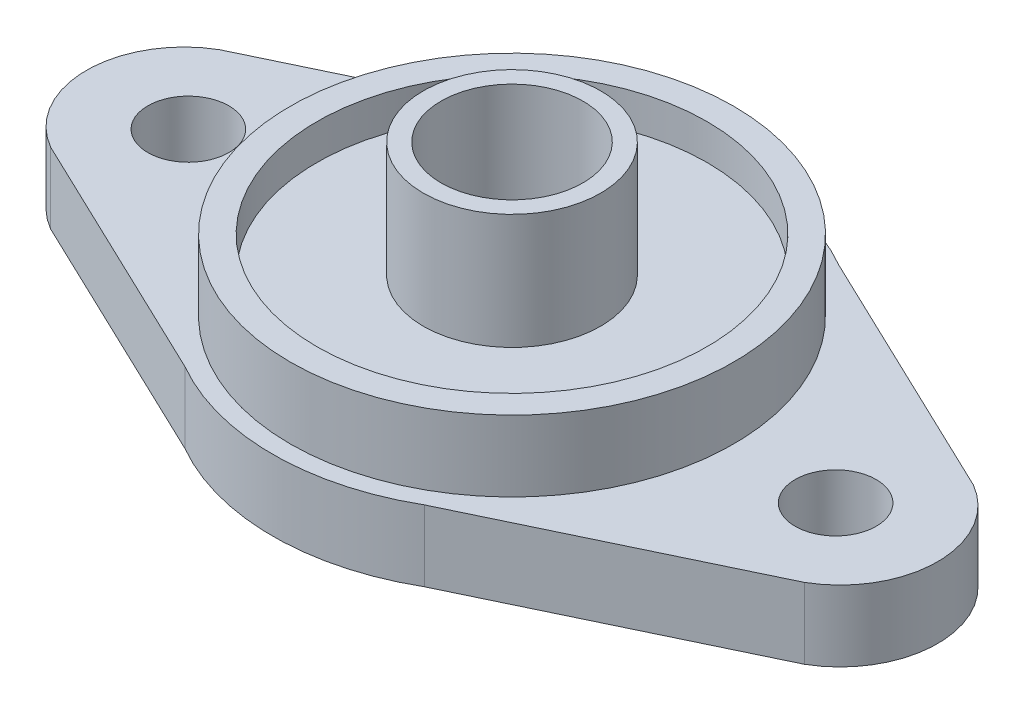
ISO-10303-21;
HEADER;
FILE_DESCRIPTION(('STEP AP214'),'2;1');
FILE_NAME('part.step','',(''),(''),'','','');
FILE_SCHEMA(('AUTOMOTIVE_DESIGN { 1 0 10303 214 1 1 1 1 }'));
ENDSEC;
DATA;
#1=APPLICATION_CONTEXT('core data for automotive mechanical design processes');
#2=APPLICATION_PROTOCOL_DEFINITION('international standard','automotive_design',2000,#1);
#3=PRODUCT_CONTEXT('',#1,'mechanical');
#4=PRODUCT('Part','Part','',(#3));
#5=PRODUCT_RELATED_PRODUCT_CATEGORY('part','',(#4));
#6=PRODUCT_DEFINITION_FORMATION('','',#4);
#7=PRODUCT_DEFINITION_CONTEXT('part definition',#1,'design');
#8=PRODUCT_DEFINITION('design','',#6,#7);
#9=PRODUCT_DEFINITION_SHAPE('','',#8);
#10=(LENGTH_UNIT() NAMED_UNIT(*) SI_UNIT(.MILLI.,.METRE.));
#11=(NAMED_UNIT(*) PLANE_ANGLE_UNIT() SI_UNIT($,.RADIAN.));
#12=(NAMED_UNIT(*) SI_UNIT($,.STERADIAN.) SOLID_ANGLE_UNIT());
#13=UNCERTAINTY_MEASURE_WITH_UNIT(LENGTH_MEASURE(1.E-05),#10,'distance_accuracy_value','');
#14=(GEOMETRIC_REPRESENTATION_CONTEXT(3) GLOBAL_UNCERTAINTY_ASSIGNED_CONTEXT((#13)) GLOBAL_UNIT_ASSIGNED_CONTEXT((#10,
#11,#12)) REPRESENTATION_CONTEXT('',''));
#15=CARTESIAN_POINT('',(0.,0.,0.));
#16=DIRECTION('',(0.,0.,1.));
#17=DIRECTION('',(1.,0.,0.));
#18=AXIS2_PLACEMENT_3D('',#15,#16,#17);
#19=CARTESIAN_POINT('',(-18.5,4.,0.));
#20=DIRECTION('',(0.,-1.,0.));
#21=DIRECTION('',(0.,0.,-1.));
#22=AXIS2_PLACEMENT_3D('',#19,#20,#21);
#23=CYLINDRICAL_SURFACE('',#22,5.49999999999998);
#24=CARTESIAN_POINT('',(-18.5,0.,0.));
#25=DIRECTION('',(0.,-1.,0.));
#26=DIRECTION('',(0.,0.,-1.));
#27=AXIS2_PLACEMENT_3D('',#24,#25,#26);
#28=CIRCLE('',#27,5.49999999999998);
#29=CARTESIAN_POINT('',(-21.25,0.,4.76313972081442));
#30=VERTEX_POINT('',#29);
#31=CARTESIAN_POINT('',(-21.25,0.,-4.76313972081438));
#32=VERTEX_POINT('',#31);
#33=EDGE_CURVE('E145',#30,#32,#28,.T.);
#34=ORIENTED_EDGE('',*,*,#33,.F.);
#35=DIRECTION('',(0.,-1.,0.));
#36=VECTOR('',#35,1.);
#37=CARTESIAN_POINT('',(-21.25,4.,4.76313972081442));
#38=LINE('',#37,#36);
#39=CARTESIAN_POINT('',(-21.25,4.,4.76313972081442));
#40=VERTEX_POINT('',#39);
#41=EDGE_CURVE('E61',#40,#30,#38,.T.);
#42=ORIENTED_EDGE('',*,*,#41,.F.);
#43=CARTESIAN_POINT('',(-18.5,4.,0.));
#44=DIRECTION('',(0.,-1.,0.));
#45=DIRECTION('',(0.,0.,-1.));
#46=AXIS2_PLACEMENT_3D('',#43,#44,#45);
#47=CIRCLE('',#46,5.49999999999998);
#48=CARTESIAN_POINT('',(-21.25,4.,-4.76313972081438));
#49=VERTEX_POINT('',#48);
#50=EDGE_CURVE('E165',#40,#49,#47,.T.);
#51=ORIENTED_EDGE('',*,*,#50,.T.);
#52=DIRECTION('',(0.,-1.,0.));
#53=VECTOR('',#52,1.);
#54=CARTESIAN_POINT('',(-21.25,4.,-4.76313972081438));
#55=LINE('',#54,#53);
#56=EDGE_CURVE('E99',#49,#32,#55,.T.);
#57=ORIENTED_EDGE('',*,*,#56,.T.);
#58=EDGE_LOOP('',(#34,#42,#51,#57));
#59=FACE_BOUND('',#58,.T.);
#60=ADVANCED_FACE('F45',(#59),#23,.T.);
#61=CARTESIAN_POINT('',(-21.25,4.,4.76313972081442));
#62=DIRECTION('',(0.4311222663223,0.,-0.90229351736623));
#63=DIRECTION('',(-0.90229351736623,0.,-0.431122266322301));
#64=AXIS2_PLACEMENT_3D('',#61,#62,#63);
#65=PLANE('',#64);
#66=DIRECTION('',(0.90229351736623,0.,0.431122266322301));
#67=VECTOR('',#66,1.);
#68=CARTESIAN_POINT('',(-21.25,0.,4.76313972081442));
#69=LINE('',#68,#67);
#70=CARTESIAN_POINT('',(-6.75000000000002,0.,11.6913429510899));
#71=VERTEX_POINT('',#70);
#72=EDGE_CURVE('E90',#30,#71,#69,.T.);
#73=ORIENTED_EDGE('',*,*,#72,.T.);
#74=DIRECTION('',(0.,-1.,0.));
#75=VECTOR('',#74,1.);
#76=CARTESIAN_POINT('',(-6.75000000000002,4.,11.6913429510899));
#77=LINE('',#76,#75);
#78=CARTESIAN_POINT('',(-6.75000000000002,4.,11.6913429510899));
#79=VERTEX_POINT('',#78);
#80=EDGE_CURVE('E132',#79,#71,#77,.T.);
#81=ORIENTED_EDGE('',*,*,#80,.F.);
#82=DIRECTION('',(0.90229351736623,0.,0.431122266322301));
#83=VECTOR('',#82,1.);
#84=CARTESIAN_POINT('',(-21.25,4.,4.76313972081442));
#85=LINE('',#84,#83);
#86=EDGE_CURVE('E122',#40,#79,#85,.T.);
#87=ORIENTED_EDGE('',*,*,#86,.F.);
#88=ORIENTED_EDGE('',*,*,#41,.T.);
#89=EDGE_LOOP('',(#73,#81,#87,#88));
#90=FACE_BOUND('',#89,.T.);
#91=ADVANCED_FACE('F260',(#90),#65,.F.);
#92=CARTESIAN_POINT('',(0.,4.,0.));
#93=DIRECTION('',(0.,-1.,0.));
#94=DIRECTION('',(0.,0.,-1.));
#95=AXIS2_PLACEMENT_3D('',#92,#93,#94);
#96=CYLINDRICAL_SURFACE('',#95,13.5);
#97=CARTESIAN_POINT('',(0.,0.,0.));
#98=DIRECTION('',(0.,1.,0.));
#99=DIRECTION('',(0.,0.,1.));
#100=AXIS2_PLACEMENT_3D('',#97,#98,#99);
#101=CIRCLE('',#100,13.5);
#102=CARTESIAN_POINT('',(6.74999999999998,0.,11.6913429510899));
#103=VERTEX_POINT('',#102);
#104=EDGE_CURVE('E129',#71,#103,#101,.T.);
#105=ORIENTED_EDGE('',*,*,#104,.T.);
#106=DIRECTION('',(0.,-1.,0.));
#107=VECTOR('',#106,1.);
#108=CARTESIAN_POINT('',(6.74999999999998,4.,11.6913429510899));
#109=LINE('',#108,#107);
#110=CARTESIAN_POINT('',(6.74999999999998,4.,11.6913429510899));
#111=VERTEX_POINT('',#110);
#112=EDGE_CURVE('E126',#111,#103,#109,.T.);
#113=ORIENTED_EDGE('',*,*,#112,.F.);
#114=CARTESIAN_POINT('',(0.,4.,0.));
#115=DIRECTION('',(0.,1.,0.));
#116=DIRECTION('',(0.,0.,1.));
#117=AXIS2_PLACEMENT_3D('',#114,#115,#116);
#118=CIRCLE('',#117,13.5);
#119=EDGE_CURVE('E115',#79,#111,#118,.T.);
#120=ORIENTED_EDGE('',*,*,#119,.F.);
#121=ORIENTED_EDGE('',*,*,#80,.T.);
#122=EDGE_LOOP('',(#105,#113,#120,#121));
#123=FACE_BOUND('',#122,.T.);
#124=ADVANCED_FACE('F127',(#123),#96,.T.);
#125=CARTESIAN_POINT('',(6.74999999999998,4.,11.6913429510899));
#126=DIRECTION('',(-0.431122266322302,0.,-0.90229351736623));
#127=DIRECTION('',(-0.90229351736623,0.,0.431122266322302));
#128=AXIS2_PLACEMENT_3D('',#125,#126,#127);
#129=PLANE('',#128);
#130=DIRECTION('',(0.90229351736623,0.,-0.431122266322302));
#131=VECTOR('',#130,1.);
#132=CARTESIAN_POINT('',(6.74999999999998,0.,11.6913429510899));
#133=LINE('',#132,#131);
#134=CARTESIAN_POINT('',(21.25,0.,4.7631397208144));
#135=VERTEX_POINT('',#134);
#136=EDGE_CURVE('E161',#103,#135,#133,.T.);
#137=ORIENTED_EDGE('',*,*,#136,.T.);
#138=DIRECTION('',(0.,-1.,0.));
#139=VECTOR('',#138,1.);
#140=CARTESIAN_POINT('',(21.25,4.,4.7631397208144));
#141=LINE('',#140,#139);
#142=CARTESIAN_POINT('',(21.25,4.,4.7631397208144));
#143=VERTEX_POINT('',#142);
#144=EDGE_CURVE('E133',#143,#135,#141,.T.);
#145=ORIENTED_EDGE('',*,*,#144,.F.);
#146=DIRECTION('',(0.90229351736623,0.,-0.431122266322302));
#147=VECTOR('',#146,1.);
#148=CARTESIAN_POINT('',(6.74999999999998,4.,11.6913429510899));
#149=LINE('',#148,#147);
#150=EDGE_CURVE('E120',#111,#143,#149,.T.);
#151=ORIENTED_EDGE('',*,*,#150,.F.);
#152=ORIENTED_EDGE('',*,*,#112,.T.);
#153=EDGE_LOOP('',(#137,#145,#151,#152));
#154=FACE_BOUND('',#153,.T.);
#155=ADVANCED_FACE('F135',(#154),#129,.F.);
#156=CARTESIAN_POINT('',(18.5,4.,0.));
#157=DIRECTION('',(0.,-1.,0.));
#158=DIRECTION('',(0.,0.,-1.));
#159=AXIS2_PLACEMENT_3D('',#156,#157,#158);
#160=CYLINDRICAL_SURFACE('',#159,5.49999999999998);
#161=CARTESIAN_POINT('',(18.5,0.,0.));
#162=DIRECTION('',(0.,1.,0.));
#163=DIRECTION('',(0.,0.,1.));
#164=AXIS2_PLACEMENT_3D('',#161,#162,#163);
#165=CIRCLE('',#164,5.49999999999998);
#166=CARTESIAN_POINT('',(21.25,0.,-4.76313972081442));
#167=VERTEX_POINT('',#166);
#168=EDGE_CURVE('E158',#135,#167,#165,.T.);
#169=ORIENTED_EDGE('',*,*,#168,.T.);
#170=DIRECTION('',(0.,-1.,0.));
#171=VECTOR('',#170,1.);
#172=CARTESIAN_POINT('',(21.25,4.,-4.76313972081442));
#173=LINE('',#172,#171);
#174=CARTESIAN_POINT('',(21.25,4.,-4.76313972081442));
#175=VERTEX_POINT('',#174);
#176=EDGE_CURVE('E169',#175,#167,#173,.T.);
#177=ORIENTED_EDGE('',*,*,#176,.F.);
#178=CARTESIAN_POINT('',(18.5,4.,0.));
#179=DIRECTION('',(0.,1.,0.));
#180=DIRECTION('',(0.,0.,1.));
#181=AXIS2_PLACEMENT_3D('',#178,#179,#180);
#182=CIRCLE('',#181,5.49999999999998);
#183=EDGE_CURVE('E138',#143,#175,#182,.T.);
#184=ORIENTED_EDGE('',*,*,#183,.F.);
#185=ORIENTED_EDGE('',*,*,#144,.T.);
#186=EDGE_LOOP('',(#169,#177,#184,#185));
#187=FACE_BOUND('',#186,.T.);
#188=ADVANCED_FACE('F180',(#187),#160,.T.);
#189=CARTESIAN_POINT('',(6.74999999999998,4.,-11.6913429510899));
#190=DIRECTION('',(0.431122266322301,0.,-0.90229351736623));
#191=DIRECTION('',(-0.90229351736623,0.,-0.431122266322301));
#192=AXIS2_PLACEMENT_3D('',#189,#190,#191);
#193=PLANE('',#192);
#194=DIRECTION('',(0.90229351736623,0.,0.431122266322301));
#195=VECTOR('',#194,1.);
#196=CARTESIAN_POINT('',(6.74999999999998,0.,-11.6913429510899));
#197=LINE('',#196,#195);
#198=CARTESIAN_POINT('',(6.74999999999998,0.,-11.6913429510899));
#199=VERTEX_POINT('',#198);
#200=EDGE_CURVE('E155',#199,#167,#197,.T.);
#201=ORIENTED_EDGE('',*,*,#200,.F.);
#202=DIRECTION('',(0.,-1.,0.));
#203=VECTOR('',#202,1.);
#204=CARTESIAN_POINT('',(6.74999999999998,4.,-11.6913429510899));
#205=LINE('',#204,#203);
#206=CARTESIAN_POINT('',(6.74999999999998,4.,-11.6913429510899));
#207=VERTEX_POINT('',#206);
#208=EDGE_CURVE('E171',#207,#199,#205,.T.);
#209=ORIENTED_EDGE('',*,*,#208,.F.);
#210=DIRECTION('',(0.90229351736623,0.,0.431122266322301));
#211=VECTOR('',#210,1.);
#212=CARTESIAN_POINT('',(6.74999999999998,4.,-11.6913429510899));
#213=LINE('',#212,#211);
#214=EDGE_CURVE('E140',#207,#175,#213,.T.);
#215=ORIENTED_EDGE('',*,*,#214,.T.);
#216=ORIENTED_EDGE('',*,*,#176,.T.);
#217=EDGE_LOOP('',(#201,#209,#215,#216));
#218=FACE_BOUND('',#217,.T.);
#219=ADVANCED_FACE('F274',(#218),#193,.T.);
#220=CARTESIAN_POINT('',(0.,4.,0.));
#221=DIRECTION('',(0.,-1.,0.));
#222=DIRECTION('',(0.,0.,-1.));
#223=AXIS2_PLACEMENT_3D('',#220,#221,#222);
#224=CYLINDRICAL_SURFACE('',#223,13.5);
#225=CARTESIAN_POINT('',(0.,0.,0.));
#226=DIRECTION('',(0.,-1.,0.));
#227=DIRECTION('',(0.,0.,-1.));
#228=AXIS2_PLACEMENT_3D('',#225,#226,#227);
#229=CIRCLE('',#228,13.5);
#230=CARTESIAN_POINT('',(-6.75000000000002,0.,-11.6913429510899));
#231=VERTEX_POINT('',#230);
#232=EDGE_CURVE('E152',#231,#199,#229,.T.);
#233=ORIENTED_EDGE('',*,*,#232,.F.);
#234=DIRECTION('',(0.,-1.,0.));
#235=VECTOR('',#234,1.);
#236=CARTESIAN_POINT('',(-6.75000000000002,4.,-11.6913429510899));
#237=LINE('',#236,#235);
#238=CARTESIAN_POINT('',(-6.75000000000002,4.,-11.6913429510899));
#239=VERTEX_POINT('',#238);
#240=EDGE_CURVE('E173',#239,#231,#237,.T.);
#241=ORIENTED_EDGE('',*,*,#240,.F.);
#242=CARTESIAN_POINT('',(0.,4.,0.));
#243=DIRECTION('',(0.,-1.,0.));
#244=DIRECTION('',(0.,0.,-1.));
#245=AXIS2_PLACEMENT_3D('',#242,#243,#244);
#246=CIRCLE('',#245,13.5);
#247=EDGE_CURVE('E186',#239,#207,#246,.T.);
#248=ORIENTED_EDGE('',*,*,#247,.T.);
#249=ORIENTED_EDGE('',*,*,#208,.T.);
#250=EDGE_LOOP('',(#233,#241,#248,#249));
#251=FACE_BOUND('',#250,.T.);
#252=ADVANCED_FACE('F189',(#251),#224,.T.);
#253=CARTESIAN_POINT('',(-21.25,4.,-4.76313972081438));
#254=DIRECTION('',(-0.431122266322303,0.,-0.902293517366229));
#255=DIRECTION('',(-0.902293517366229,0.,0.431122266322303));
#256=AXIS2_PLACEMENT_3D('',#253,#254,#255);
#257=PLANE('',#256);
#258=DIRECTION('',(0.902293517366229,0.,-0.431122266322303));
#259=VECTOR('',#258,1.);
#260=CARTESIAN_POINT('',(-21.25,0.,-4.76313972081438));
#261=LINE('',#260,#259);
#262=EDGE_CURVE('E148',#32,#231,#261,.T.);
#263=ORIENTED_EDGE('',*,*,#262,.F.);
#264=ORIENTED_EDGE('',*,*,#56,.F.);
#265=DIRECTION('',(0.902293517366229,0.,-0.431122266322303));
#266=VECTOR('',#265,1.);
#267=CARTESIAN_POINT('',(-21.25,4.,-4.76313972081438));
#268=LINE('',#267,#266);
#269=EDGE_CURVE('E191',#49,#239,#268,.T.);
#270=ORIENTED_EDGE('',*,*,#269,.T.);
#271=ORIENTED_EDGE('',*,*,#240,.T.);
#272=EDGE_LOOP('',(#263,#264,#270,#271));
#273=FACE_BOUND('',#272,.T.);
#274=ADVANCED_FACE('F174',(#273),#257,.T.);
#275=CARTESIAN_POINT('',(-18.5,4.,0.));
#276=DIRECTION('',(0.,-1.,0.));
#277=DIRECTION('',(0.,0.,-1.));
#278=AXIS2_PLACEMENT_3D('',#275,#276,#277);
#279=PLANE('',#278);
#280=CARTESIAN_POINT('',(-18.25,4.,0.));
#281=DIRECTION('',(0.,-1.,0.));
#282=DIRECTION('',(0.,0.,-1.));
#283=AXIS2_PLACEMENT_3D('',#280,#281,#282);
#284=CIRCLE('',#283,2.28591738511676);
#285=CARTESIAN_POINT('',(-18.25,4.,-2.28591738511676));
#286=VERTEX_POINT('',#285);
#287=EDGE_CURVE('E212',#286,#286,#284,.F.);
#288=ORIENTED_EDGE('',*,*,#287,.F.);
#289=EDGE_LOOP('',(#288));
#290=FACE_BOUND('',#289,.T.);
#291=CARTESIAN_POINT('',(18.25,4.,0.));
#292=DIRECTION('',(0.,-1.,0.));
#293=DIRECTION('',(0.,0.,-1.));
#294=AXIS2_PLACEMENT_3D('',#291,#292,#293);
#295=CIRCLE('',#294,2.28591738511676);
#296=CARTESIAN_POINT('',(18.25,4.,-2.28591738511676));
#297=VERTEX_POINT('',#296);
#298=EDGE_CURVE('E215',#297,#297,#295,.F.);
#299=ORIENTED_EDGE('',*,*,#298,.F.);
#300=EDGE_LOOP('',(#299));
#301=FACE_BOUND('',#300,.T.);
#302=CARTESIAN_POINT('',(0.,4.,0.));
#303=DIRECTION('',(0.,-1.,0.));
#304=DIRECTION('',(0.,0.,-1.));
#305=AXIS2_PLACEMENT_3D('',#302,#303,#304);
#306=CIRCLE('',#305,12.5);
#307=CARTESIAN_POINT('',(0.,4.,-12.5));
#308=VERTEX_POINT('',#307);
#309=EDGE_CURVE('E53',#308,#308,#306,.F.);
#310=ORIENTED_EDGE('',*,*,#309,.F.);
#311=EDGE_LOOP('',(#310));
#312=FACE_BOUND('',#311,.T.);
#313=ORIENTED_EDGE('',*,*,#50,.F.);
#314=ORIENTED_EDGE('',*,*,#86,.T.);
#315=ORIENTED_EDGE('',*,*,#119,.T.);
#316=ORIENTED_EDGE('',*,*,#150,.T.);
#317=ORIENTED_EDGE('',*,*,#183,.T.);
#318=ORIENTED_EDGE('',*,*,#214,.F.);
#319=ORIENTED_EDGE('',*,*,#247,.F.);
#320=ORIENTED_EDGE('',*,*,#269,.F.);
#321=EDGE_LOOP('',(#313,#314,#315,#316,#317,#318,#319,#320));
#322=FACE_BOUND('',#321,.T.);
#323=ADVANCED_FACE('F118',(#290,#301,#312,#322),#279,.F.);
#324=CARTESIAN_POINT('',(-18.5,0.,0.));
#325=DIRECTION('',(0.,-1.,0.));
#326=DIRECTION('',(0.,0.,-1.));
#327=AXIS2_PLACEMENT_3D('',#324,#325,#326);
#328=PLANE('',#327);
#329=CARTESIAN_POINT('',(-18.25,0.,0.));
#330=DIRECTION('',(0.,1.,0.));
#331=DIRECTION('',(0.,0.,1.));
#332=AXIS2_PLACEMENT_3D('',#329,#330,#331);
#333=CIRCLE('',#332,2.28591738511676);
#334=CARTESIAN_POINT('',(-18.25,0.,2.28591738511676));
#335=VERTEX_POINT('',#334);
#336=EDGE_CURVE('E218',#335,#335,#333,.T.);
#337=ORIENTED_EDGE('',*,*,#336,.T.);
#338=EDGE_LOOP('',(#337));
#339=FACE_BOUND('',#338,.T.);
#340=CARTESIAN_POINT('',(18.25,0.,0.));
#341=DIRECTION('',(0.,1.,0.));
#342=DIRECTION('',(0.,0.,1.));
#343=AXIS2_PLACEMENT_3D('',#340,#341,#342);
#344=CIRCLE('',#343,2.28591738511676);
#345=CARTESIAN_POINT('',(18.25,0.,2.28591738511676));
#346=VERTEX_POINT('',#345);
#347=EDGE_CURVE('E222',#346,#346,#344,.T.);
#348=ORIENTED_EDGE('',*,*,#347,.T.);
#349=EDGE_LOOP('',(#348));
#350=FACE_BOUND('',#349,.T.);
#351=CARTESIAN_POINT('',(0.,0.,0.));
#352=DIRECTION('',(0.,1.,0.));
#353=DIRECTION('',(0.,0.,1.));
#354=AXIS2_PLACEMENT_3D('',#351,#352,#353);
#355=CIRCLE('',#354,4.);
#356=CARTESIAN_POINT('',(0.,0.,4.));
#357=VERTEX_POINT('',#356);
#358=EDGE_CURVE('E219',#357,#357,#355,.T.);
#359=ORIENTED_EDGE('',*,*,#358,.T.);
#360=EDGE_LOOP('',(#359));
#361=FACE_BOUND('',#360,.T.);
#362=ORIENTED_EDGE('',*,*,#33,.T.);
#363=ORIENTED_EDGE('',*,*,#262,.T.);
#364=ORIENTED_EDGE('',*,*,#232,.T.);
#365=ORIENTED_EDGE('',*,*,#200,.T.);
#366=ORIENTED_EDGE('',*,*,#168,.F.);
#367=ORIENTED_EDGE('',*,*,#136,.F.);
#368=ORIENTED_EDGE('',*,*,#104,.F.);
#369=ORIENTED_EDGE('',*,*,#72,.F.);
#370=EDGE_LOOP('',(#362,#363,#364,#365,#366,#367,#368,#369));
#371=FACE_BOUND('',#370,.T.);
#372=ADVANCED_FACE('F177',(#339,#350,#361,#371),#328,.T.);
#373=CARTESIAN_POINT('',(0.,8.,0.));
#374=DIRECTION('',(0.,-1.,0.));
#375=DIRECTION('',(0.,0.,-1.));
#376=AXIS2_PLACEMENT_3D('',#373,#374,#375);
#377=CYLINDRICAL_SURFACE('',#376,12.5);
#378=CARTESIAN_POINT('',(0.,8.,0.));
#379=DIRECTION('',(0.,1.,0.));
#380=DIRECTION('',(0.,0.,1.));
#381=AXIS2_PLACEMENT_3D('',#378,#379,#380);
#382=CIRCLE('',#381,12.5);
#383=CARTESIAN_POINT('',(0.,8.,12.5));
#384=VERTEX_POINT('',#383);
#385=EDGE_CURVE('E149',#384,#384,#382,.T.);
#386=ORIENTED_EDGE('',*,*,#385,.F.);
#387=EDGE_LOOP('',(#386));
#388=FACE_BOUND('',#387,.T.);
#389=ORIENTED_EDGE('',*,*,#309,.T.);
#390=EDGE_LOOP('',(#389));
#391=FACE_BOUND('',#390,.T.);
#392=ADVANCED_FACE('F244',(#388,#391),#377,.T.);
#393=CARTESIAN_POINT('',(0.,8.,0.));
#394=DIRECTION('',(0.,-1.,0.));
#395=DIRECTION('',(0.,0.,-1.));
#396=AXIS2_PLACEMENT_3D('',#393,#394,#395);
#397=CYLINDRICAL_SURFACE('',#396,11.);
#398=CARTESIAN_POINT('',(0.,6.,0.));
#399=DIRECTION('',(0.,1.,0.));
#400=DIRECTION('',(0.,0.,1.));
#401=AXIS2_PLACEMENT_3D('',#398,#399,#400);
#402=CIRCLE('',#401,11.);
#403=CARTESIAN_POINT('',(0.,6.,11.));
#404=VERTEX_POINT('',#403);
#405=EDGE_CURVE('E12',#404,#404,#402,.T.);
#406=ORIENTED_EDGE('',*,*,#405,.F.);
#407=EDGE_LOOP('',(#406));
#408=FACE_BOUND('',#407,.T.);
#409=CARTESIAN_POINT('',(0.,8.,0.));
#410=DIRECTION('',(0.,1.,0.));
#411=DIRECTION('',(0.,0.,1.));
#412=AXIS2_PLACEMENT_3D('',#409,#410,#411);
#413=CIRCLE('',#412,11.);
#414=CARTESIAN_POINT('',(0.,8.,11.));
#415=VERTEX_POINT('',#414);
#416=EDGE_CURVE('E200',#415,#415,#413,.T.);
#417=ORIENTED_EDGE('',*,*,#416,.T.);
#418=EDGE_LOOP('',(#417));
#419=FACE_BOUND('',#418,.T.);
#420=ADVANCED_FACE('F246',(#408,#419),#397,.F.);
#421=CARTESIAN_POINT('',(0.,8.,0.));
#422=DIRECTION('',(0.,1.,0.));
#423=DIRECTION('',(0.,0.,1.));
#424=AXIS2_PLACEMENT_3D('',#421,#422,#423);
#425=PLANE('',#424);
#426=ORIENTED_EDGE('',*,*,#385,.T.);
#427=EDGE_LOOP('',(#426));
#428=FACE_BOUND('',#427,.T.);
#429=ORIENTED_EDGE('',*,*,#416,.F.);
#430=EDGE_LOOP('',(#429));
#431=FACE_BOUND('',#430,.T.);
#432=ADVANCED_FACE('F253',(#428,#431),#425,.T.);
#433=CARTESIAN_POINT('',(0.,6.,0.));
#434=DIRECTION('',(0.,1.,0.));
#435=DIRECTION('',(0.,0.,1.));
#436=AXIS2_PLACEMENT_3D('',#433,#434,#435);
#437=PLANE('',#436);
#438=ORIENTED_EDGE('',*,*,#405,.T.);
#439=EDGE_LOOP('',(#438));
#440=FACE_BOUND('',#439,.T.);
#441=CARTESIAN_POINT('',(0.,6.,0.));
#442=DIRECTION('',(0.,1.,0.));
#443=DIRECTION('',(0.,0.,1.));
#444=AXIS2_PLACEMENT_3D('',#441,#442,#443);
#445=CIRCLE('',#444,5.);
#446=CARTESIAN_POINT('',(0.,6.,5.));
#447=VERTEX_POINT('',#446);
#448=EDGE_CURVE('E209',#447,#447,#445,.T.);
#449=ORIENTED_EDGE('',*,*,#448,.F.);
#450=EDGE_LOOP('',(#449));
#451=FACE_BOUND('',#450,.T.);
#452=ADVANCED_FACE('F304',(#440,#451),#437,.T.);
#453=CARTESIAN_POINT('',(0.,12.5,0.));
#454=DIRECTION('',(0.,-1.,0.));
#455=DIRECTION('',(0.,0.,-1.));
#456=AXIS2_PLACEMENT_3D('',#453,#454,#455);
#457=CYLINDRICAL_SURFACE('',#456,4.);
#458=CARTESIAN_POINT('',(0.,12.5,0.));
#459=DIRECTION('',(0.,1.,0.));
#460=DIRECTION('',(0.,0.,1.));
#461=AXIS2_PLACEMENT_3D('',#458,#459,#460);
#462=CIRCLE('',#461,4.);
#463=CARTESIAN_POINT('',(0.,12.5,4.));
#464=VERTEX_POINT('',#463);
#465=EDGE_CURVE('E206',#464,#464,#462,.T.);
#466=ORIENTED_EDGE('',*,*,#465,.T.);
#467=EDGE_LOOP('',(#466));
#468=FACE_BOUND('',#467,.T.);
#469=ORIENTED_EDGE('',*,*,#358,.F.);
#470=EDGE_LOOP('',(#469));
#471=FACE_BOUND('',#470,.T.);
#472=ADVANCED_FACE('F298',(#468,#471),#457,.F.);
#473=CARTESIAN_POINT('',(0.,12.5,0.));
#474=DIRECTION('',(0.,1.,0.));
#475=DIRECTION('',(0.,0.,1.));
#476=AXIS2_PLACEMENT_3D('',#473,#474,#475);
#477=PLANE('',#476);
#478=CARTESIAN_POINT('',(0.,12.5,0.));
#479=DIRECTION('',(0.,1.,0.));
#480=DIRECTION('',(0.,0.,1.));
#481=AXIS2_PLACEMENT_3D('',#478,#479,#480);
#482=CIRCLE('',#481,5.);
#483=CARTESIAN_POINT('',(0.,12.5,5.));
#484=VERTEX_POINT('',#483);
#485=EDGE_CURVE('E203',#484,#484,#482,.T.);
#486=ORIENTED_EDGE('',*,*,#485,.T.);
#487=EDGE_LOOP('',(#486));
#488=FACE_BOUND('',#487,.T.);
#489=ORIENTED_EDGE('',*,*,#465,.F.);
#490=EDGE_LOOP('',(#489));
#491=FACE_BOUND('',#490,.T.);
#492=ADVANCED_FACE('F303',(#488,#491),#477,.T.);
#493=CARTESIAN_POINT('',(0.,12.5,0.));
#494=DIRECTION('',(0.,-1.,0.));
#495=DIRECTION('',(0.,0.,-1.));
#496=AXIS2_PLACEMENT_3D('',#493,#494,#495);
#497=CYLINDRICAL_SURFACE('',#496,5.);
#498=ORIENTED_EDGE('',*,*,#448,.T.);
#499=EDGE_LOOP('',(#498));
#500=FACE_BOUND('',#499,.T.);
#501=ORIENTED_EDGE('',*,*,#485,.F.);
#502=EDGE_LOOP('',(#501));
#503=FACE_BOUND('',#502,.T.);
#504=ADVANCED_FACE('F318',(#500,#503),#497,.T.);
#505=CARTESIAN_POINT('',(18.25,12.5,0.));
#506=DIRECTION('',(0.,-1.,0.));
#507=DIRECTION('',(0.,0.,-1.));
#508=AXIS2_PLACEMENT_3D('',#505,#506,#507);
#509=CYLINDRICAL_SURFACE('',#508,2.28591738511676);
#510=ORIENTED_EDGE('',*,*,#347,.F.);
#511=EDGE_LOOP('',(#510));
#512=FACE_BOUND('',#511,.T.);
#513=ORIENTED_EDGE('',*,*,#298,.T.);
#514=EDGE_LOOP('',(#513));
#515=FACE_BOUND('',#514,.T.);
#516=ADVANCED_FACE('F233',(#512,#515),#509,.F.);
#517=CARTESIAN_POINT('',(-18.25,12.5,0.));
#518=DIRECTION('',(0.,-1.,0.));
#519=DIRECTION('',(0.,0.,-1.));
#520=AXIS2_PLACEMENT_3D('',#517,#518,#519);
#521=CYLINDRICAL_SURFACE('',#520,2.28591738511676);
#522=ORIENTED_EDGE('',*,*,#336,.F.);
#523=EDGE_LOOP('',(#522));
#524=FACE_BOUND('',#523,.T.);
#525=ORIENTED_EDGE('',*,*,#287,.T.);
#526=EDGE_LOOP('',(#525));
#527=FACE_BOUND('',#526,.T.);
#528=ADVANCED_FACE('F230',(#524,#527),#521,.F.);
#529=CLOSED_SHELL('',(#60,#91,#124,#155,#188,#219,#252,#274,#323,#372,#392,#420,#432,#452,#472,
#492,#504,#516,#528));
#530=MANIFOLD_SOLID_BREP('B2',#529);
#531=ADVANCED_BREP_SHAPE_REPRESENTATION('',(#18,#530),#14);
#532=SHAPE_DEFINITION_REPRESENTATION(#9,#531);
ENDSEC;
END-ISO-10303-21;
